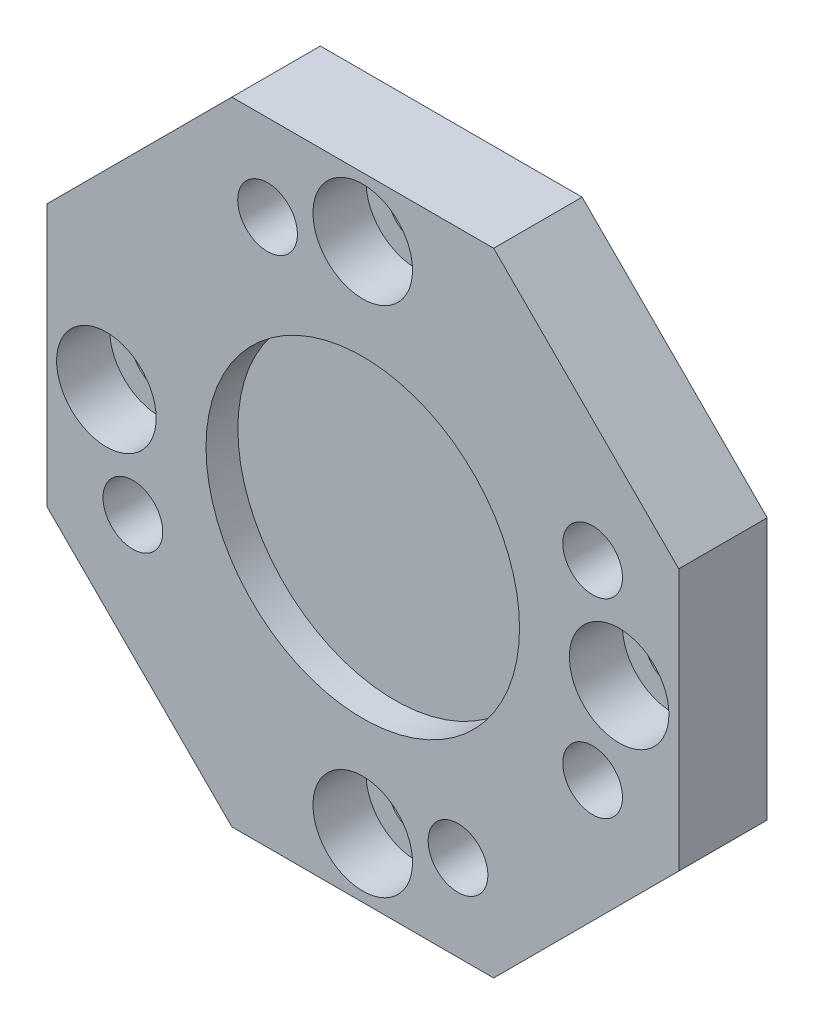
ISO-10303-21;
HEADER;
FILE_DESCRIPTION(('STEP AP214'),'2;1');
FILE_NAME('part.step','',(''),(''),'','','');
FILE_SCHEMA(('AUTOMOTIVE_DESIGN { 1 0 10303 214 1 1 1 1 }'));
ENDSEC;
DATA;
#1=APPLICATION_CONTEXT('core data for automotive mechanical design processes');
#2=APPLICATION_PROTOCOL_DEFINITION('international standard','automotive_design',2000,#1);
#3=PRODUCT_CONTEXT('',#1,'mechanical');
#4=PRODUCT('Part','Part','',(#3));
#5=PRODUCT_RELATED_PRODUCT_CATEGORY('part','',(#4));
#6=PRODUCT_DEFINITION_FORMATION('','',#4);
#7=PRODUCT_DEFINITION_CONTEXT('part definition',#1,'design');
#8=PRODUCT_DEFINITION('design','',#6,#7);
#9=PRODUCT_DEFINITION_SHAPE('','',#8);
#10=(LENGTH_UNIT() NAMED_UNIT(*) SI_UNIT(.MILLI.,.METRE.));
#11=(NAMED_UNIT(*) PLANE_ANGLE_UNIT() SI_UNIT($,.RADIAN.));
#12=(NAMED_UNIT(*) SI_UNIT($,.STERADIAN.) SOLID_ANGLE_UNIT());
#13=UNCERTAINTY_MEASURE_WITH_UNIT(LENGTH_MEASURE(1.E-05),#10,'distance_accuracy_value','');
#14=(GEOMETRIC_REPRESENTATION_CONTEXT(3) GLOBAL_UNCERTAINTY_ASSIGNED_CONTEXT((#13)) GLOBAL_UNIT_ASSIGNED_CONTEXT((#10,
#11,#12)) REPRESENTATION_CONTEXT('',''));
#15=CARTESIAN_POINT('',(0.,0.,0.));
#16=DIRECTION('',(0.,0.,1.));
#17=DIRECTION('',(1.,0.,0.));
#18=AXIS2_PLACEMENT_3D('',#15,#16,#17);
#19=CARTESIAN_POINT('',(0.,0.,0.));
#20=DIRECTION('',(0.,0.,1.));
#21=DIRECTION('',(1.,0.,0.));
#22=AXIS2_PLACEMENT_3D('',#19,#20,#21);
#23=PLANE('',#22);
#24=CARTESIAN_POINT('',(23.0969883127822,-9.56708580912725,0.));
#25=DIRECTION('',(0.,0.,1.));
#26=DIRECTION('',(1.,0.,0.));
#27=AXIS2_PLACEMENT_3D('',#24,#25,#26);
#28=CIRCLE('',#27,3.);
#29=CARTESIAN_POINT('',(26.0969883127822,-9.56708580912725,0.));
#30=VERTEX_POINT('',#29);
#31=EDGE_CURVE('E325',#30,#30,#28,.T.);
#32=ORIENTED_EDGE('',*,*,#31,.T.);
#33=EDGE_LOOP('',(#32));
#34=FACE_BOUND('',#33,.T.);
#35=CARTESIAN_POINT('',(23.0969883127822,9.56708580912723,0.));
#36=DIRECTION('',(0.,0.,-1.));
#37=DIRECTION('',(-1.,0.,0.));
#38=AXIS2_PLACEMENT_3D('',#35,#36,#37);
#39=CIRCLE('',#38,3.);
#40=CARTESIAN_POINT('',(20.0969883127822,9.56708580912723,0.));
#41=VERTEX_POINT('',#40);
#42=EDGE_CURVE('E313',#41,#41,#39,.T.);
#43=ORIENTED_EDGE('',*,*,#42,.F.);
#44=EDGE_LOOP('',(#43));
#45=FACE_BOUND('',#44,.T.);
#46=CARTESIAN_POINT('',(-9.56708580912724,23.0969883127822,0.));
#47=DIRECTION('',(0.,0.,-1.));
#48=DIRECTION('',(-1.,0.,0.));
#49=AXIS2_PLACEMENT_3D('',#46,#47,#48);
#50=CIRCLE('',#49,3.);
#51=CARTESIAN_POINT('',(-12.5670858091272,23.0969883127822,0.));
#52=VERTEX_POINT('',#51);
#53=EDGE_CURVE('E305',#52,#52,#50,.T.);
#54=ORIENTED_EDGE('',*,*,#53,.F.);
#55=EDGE_LOOP('',(#54));
#56=FACE_BOUND('',#55,.T.);
#57=CARTESIAN_POINT('',(-23.0969883127822,-9.56708580912724,0.));
#58=DIRECTION('',(0.,0.,-1.));
#59=DIRECTION('',(-1.,0.,0.));
#60=AXIS2_PLACEMENT_3D('',#57,#58,#59);
#61=CIRCLE('',#60,3.);
#62=CARTESIAN_POINT('',(-26.0969883127822,-9.56708580912724,0.));
#63=VERTEX_POINT('',#62);
#64=EDGE_CURVE('E297',#63,#63,#61,.T.);
#65=ORIENTED_EDGE('',*,*,#64,.F.);
#66=EDGE_LOOP('',(#65));
#67=FACE_BOUND('',#66,.T.);
#68=CARTESIAN_POINT('',(0.,25.76,0.));
#69=DIRECTION('',(0.,0.,1.));
#70=DIRECTION('',(1.,0.,0.));
#71=AXIS2_PLACEMENT_3D('',#68,#69,#70);
#72=CIRCLE('',#71,2.75);
#73=CARTESIAN_POINT('',(2.74999999999999,25.76,0.));
#74=VERTEX_POINT('',#73);
#75=EDGE_CURVE('E277',#74,#74,#72,.T.);
#76=ORIENTED_EDGE('',*,*,#75,.T.);
#77=EDGE_LOOP('',(#76));
#78=FACE_BOUND('',#77,.T.);
#79=CARTESIAN_POINT('',(25.76,0.,0.));
#80=DIRECTION('',(0.,0.,1.));
#81=DIRECTION('',(1.,0.,0.));
#82=AXIS2_PLACEMENT_3D('',#79,#80,#81);
#83=CIRCLE('',#82,2.75);
#84=CARTESIAN_POINT('',(28.51,0.,0.));
#85=VERTEX_POINT('',#84);
#86=EDGE_CURVE('E261',#85,#85,#83,.T.);
#87=ORIENTED_EDGE('',*,*,#86,.T.);
#88=EDGE_LOOP('',(#87));
#89=FACE_BOUND('',#88,.T.);
#90=CARTESIAN_POINT('',(0.,-25.76,0.));
#91=DIRECTION('',(0.,0.,1.));
#92=DIRECTION('',(1.,0.,0.));
#93=AXIS2_PLACEMENT_3D('',#90,#91,#92);
#94=CIRCLE('',#93,2.75);
#95=CARTESIAN_POINT('',(2.75000000000001,-25.76,0.));
#96=VERTEX_POINT('',#95);
#97=EDGE_CURVE('E245',#96,#96,#94,.T.);
#98=ORIENTED_EDGE('',*,*,#97,.T.);
#99=EDGE_LOOP('',(#98));
#100=FACE_BOUND('',#99,.T.);
#101=CARTESIAN_POINT('',(-25.76,0.,0.));
#102=DIRECTION('',(0.,0.,1.));
#103=DIRECTION('',(1.,0.,0.));
#104=AXIS2_PLACEMENT_3D('',#101,#102,#103);
#105=CIRCLE('',#104,2.75);
#106=CARTESIAN_POINT('',(-23.01,0.,0.));
#107=VERTEX_POINT('',#106);
#108=EDGE_CURVE('E229',#107,#107,#105,.T.);
#109=ORIENTED_EDGE('',*,*,#108,.T.);
#110=EDGE_LOOP('',(#109));
#111=FACE_BOUND('',#110,.T.);
#112=CARTESIAN_POINT('',(0.,0.,0.));
#113=DIRECTION('',(0.,0.,1.));
#114=DIRECTION('',(1.,0.,0.));
#115=AXIS2_PLACEMENT_3D('',#112,#113,#114);
#116=CIRCLE('',#115,21.8059);
#117=CARTESIAN_POINT('',(21.8059,0.,0.));
#118=VERTEX_POINT('',#117);
#119=EDGE_CURVE('E210',#118,#118,#116,.T.);
#120=ORIENTED_EDGE('',*,*,#119,.T.);
#121=EDGE_LOOP('',(#120));
#122=FACE_BOUND('',#121,.T.);
#123=DIRECTION('',(-0.707106781186548,0.707106781186547,0.));
#124=VECTOR('',#123,1.);
#125=CARTESIAN_POINT('',(22.4506403026729,22.4506403026729,0.));
#126=LINE('',#125,#124);
#127=CARTESIAN_POINT('',(31.7500000000001,13.1512806053458,0.));
#128=VERTEX_POINT('',#127);
#129=CARTESIAN_POINT('',(13.1512806053458,31.75,0.));
#130=VERTEX_POINT('',#129);
#131=EDGE_CURVE('E143',#128,#130,#126,.T.);
#132=ORIENTED_EDGE('',*,*,#131,.F.);
#133=DIRECTION('',(0.,1.,0.));
#134=VECTOR('',#133,1.);
#135=CARTESIAN_POINT('',(31.7500000000001,0.,0.));
#136=LINE('',#135,#134);
#137=CARTESIAN_POINT('',(31.7500000000001,-13.1512806053458,0.));
#138=VERTEX_POINT('',#137);
#139=EDGE_CURVE('E94',#138,#128,#136,.T.);
#140=ORIENTED_EDGE('',*,*,#139,.F.);
#141=DIRECTION('',(0.707106781186547,0.707106781186548,0.));
#142=VECTOR('',#141,1.);
#143=CARTESIAN_POINT('',(22.4506403026729,-22.4506403026729,0.));
#144=LINE('',#143,#142);
#145=CARTESIAN_POINT('',(13.1512806053458,-31.75,0.));
#146=VERTEX_POINT('',#145);
#147=EDGE_CURVE('E88',#146,#138,#144,.T.);
#148=ORIENTED_EDGE('',*,*,#147,.F.);
#149=DIRECTION('',(1.,0.,0.));
#150=VECTOR('',#149,1.);
#151=CARTESIAN_POINT('',(0.,-31.75,0.));
#152=LINE('',#151,#150);
#153=CARTESIAN_POINT('',(-13.1512806053457,-31.75,0.));
#154=VERTEX_POINT('',#153);
#155=EDGE_CURVE('E130',#154,#146,#152,.T.);
#156=ORIENTED_EDGE('',*,*,#155,.F.);
#157=DIRECTION('',(0.707106781186548,-0.707106781186547,0.));
#158=VECTOR('',#157,1.);
#159=CARTESIAN_POINT('',(-22.4506403026728,-22.4506403026729,0.));
#160=LINE('',#159,#158);
#161=CARTESIAN_POINT('',(-31.7499999999999,-13.1512806053458,0.));
#162=VERTEX_POINT('',#161);
#163=EDGE_CURVE('E157',#162,#154,#160,.T.);
#164=ORIENTED_EDGE('',*,*,#163,.F.);
#165=DIRECTION('',(0.,-1.,0.));
#166=VECTOR('',#165,1.);
#167=CARTESIAN_POINT('',(-31.7499999999999,0.,0.));
#168=LINE('',#167,#166);
#169=CARTESIAN_POINT('',(-31.7499999999999,13.1512806053458,0.));
#170=VERTEX_POINT('',#169);
#171=EDGE_CURVE('E154',#170,#162,#168,.T.);
#172=ORIENTED_EDGE('',*,*,#171,.F.);
#173=DIRECTION('',(-0.707106781186547,-0.707106781186548,0.));
#174=VECTOR('',#173,1.);
#175=CARTESIAN_POINT('',(-22.4506403026729,22.4506403026728,0.));
#176=LINE('',#175,#174);
#177=CARTESIAN_POINT('',(-13.1512806053457,31.75,0.));
#178=VERTEX_POINT('',#177);
#179=EDGE_CURVE('E151',#178,#170,#176,.T.);
#180=ORIENTED_EDGE('',*,*,#179,.F.);
#181=DIRECTION('',(-1.,0.,0.));
#182=VECTOR('',#181,1.);
#183=CARTESIAN_POINT('',(0.,31.75,0.));
#184=LINE('',#183,#182);
#185=EDGE_CURVE('E147',#130,#178,#184,.T.);
#186=ORIENTED_EDGE('',*,*,#185,.F.);
#187=EDGE_LOOP('',(#132,#140,#148,#156,#164,#172,#180,#186));
#188=FACE_BOUND('',#187,.T.);
#189=CARTESIAN_POINT('',(9.56708580912724,-23.0969883127822,0.));
#190=DIRECTION('',(0.,0.,-1.));
#191=DIRECTION('',(-1.,0.,0.));
#192=AXIS2_PLACEMENT_3D('',#189,#190,#191);
#193=CIRCLE('',#192,3.);
#194=CARTESIAN_POINT('',(6.56708580912723,-23.0969883127822,0.));
#195=VERTEX_POINT('',#194);
#196=EDGE_CURVE('E286',#195,#195,#193,.T.);
#197=ORIENTED_EDGE('',*,*,#196,.F.);
#198=EDGE_LOOP('',(#197));
#199=FACE_BOUND('',#198,.T.);
#200=ADVANCED_FACE('F41',(#34,#45,#56,#67,#78,#89,#100,#111,#122,#188,#199),#23,.F.);
#201=CARTESIAN_POINT('',(22.4506403026729,22.4506403026729,8.89));
#202=DIRECTION('',(-0.707106781186547,-0.707106781186548,0.));
#203=DIRECTION('',(0.707106781186548,-0.707106781186547,0.));
#204=AXIS2_PLACEMENT_3D('',#201,#202,#203);
#205=PLANE('',#204);
#206=ORIENTED_EDGE('',*,*,#131,.T.);
#207=DIRECTION('',(0.,0.,-1.));
#208=VECTOR('',#207,1.);
#209=CARTESIAN_POINT('',(13.1512806053458,31.75,8.89));
#210=LINE('',#209,#208);
#211=CARTESIAN_POINT('',(13.1512806053458,31.75,8.89));
#212=VERTEX_POINT('',#211);
#213=EDGE_CURVE('E11',#212,#130,#210,.T.);
#214=ORIENTED_EDGE('',*,*,#213,.F.);
#215=DIRECTION('',(-0.707106781186548,0.707106781186547,0.));
#216=VECTOR('',#215,1.);
#217=CARTESIAN_POINT('',(22.4506403026729,22.4506403026729,8.89));
#218=LINE('',#217,#216);
#219=CARTESIAN_POINT('',(31.7500000000001,13.1512806053458,8.89));
#220=VERTEX_POINT('',#219);
#221=EDGE_CURVE('E166',#220,#212,#218,.T.);
#222=ORIENTED_EDGE('',*,*,#221,.F.);
#223=DIRECTION('',(0.,0.,-1.));
#224=VECTOR('',#223,1.);
#225=CARTESIAN_POINT('',(31.7500000000001,13.1512806053458,8.89));
#226=LINE('',#225,#224);
#227=EDGE_CURVE('E139',#220,#128,#226,.T.);
#228=ORIENTED_EDGE('',*,*,#227,.T.);
#229=EDGE_LOOP('',(#206,#214,#222,#228));
#230=FACE_BOUND('',#229,.T.);
#231=ADVANCED_FACE('F43',(#230),#205,.F.);
#232=CARTESIAN_POINT('',(0.,31.75,8.89));
#233=DIRECTION('',(0.,-1.,0.));
#234=DIRECTION('',(0.,0.,-1.));
#235=AXIS2_PLACEMENT_3D('',#232,#233,#234);
#236=PLANE('',#235);
#237=ORIENTED_EDGE('',*,*,#185,.T.);
#238=DIRECTION('',(0.,0.,-1.));
#239=VECTOR('',#238,1.);
#240=CARTESIAN_POINT('',(-13.1512806053457,31.75,8.89));
#241=LINE('',#240,#239);
#242=CARTESIAN_POINT('',(-13.1512806053457,31.75,8.89));
#243=VERTEX_POINT('',#242);
#244=EDGE_CURVE('E51',#243,#178,#241,.T.);
#245=ORIENTED_EDGE('',*,*,#244,.F.);
#246=DIRECTION('',(-1.,0.,0.));
#247=VECTOR('',#246,1.);
#248=CARTESIAN_POINT('',(0.,31.75,8.89));
#249=LINE('',#248,#247);
#250=EDGE_CURVE('E102',#212,#243,#249,.T.);
#251=ORIENTED_EDGE('',*,*,#250,.F.);
#252=ORIENTED_EDGE('',*,*,#213,.T.);
#253=EDGE_LOOP('',(#237,#245,#251,#252));
#254=FACE_BOUND('',#253,.T.);
#255=ADVANCED_FACE('F383',(#254),#236,.F.);
#256=CARTESIAN_POINT('',(-22.4506403026729,22.4506403026728,8.89));
#257=DIRECTION('',(0.707106781186548,-0.707106781186547,0.));
#258=DIRECTION('',(0.707106781186547,0.707106781186548,0.));
#259=AXIS2_PLACEMENT_3D('',#256,#257,#258);
#260=PLANE('',#259);
#261=ORIENTED_EDGE('',*,*,#179,.T.);
#262=DIRECTION('',(0.,0.,-1.));
#263=VECTOR('',#262,1.);
#264=CARTESIAN_POINT('',(-31.7499999999999,13.1512806053458,8.89));
#265=LINE('',#264,#263);
#266=CARTESIAN_POINT('',(-31.7499999999999,13.1512806053458,8.89));
#267=VERTEX_POINT('',#266);
#268=EDGE_CURVE('E177',#267,#170,#265,.T.);
#269=ORIENTED_EDGE('',*,*,#268,.F.);
#270=DIRECTION('',(-0.707106781186547,-0.707106781186548,0.));
#271=VECTOR('',#270,1.);
#272=CARTESIAN_POINT('',(-22.4506403026729,22.4506403026728,8.89));
#273=LINE('',#272,#271);
#274=EDGE_CURVE('E187',#243,#267,#273,.T.);
#275=ORIENTED_EDGE('',*,*,#274,.F.);
#276=ORIENTED_EDGE('',*,*,#244,.T.);
#277=EDGE_LOOP('',(#261,#269,#275,#276));
#278=FACE_BOUND('',#277,.T.);
#279=ADVANCED_FACE('F185',(#278),#260,.F.);
#280=CARTESIAN_POINT('',(-31.7499999999999,0.,8.89));
#281=DIRECTION('',(1.,0.,0.));
#282=DIRECTION('',(0.,0.,-1.));
#283=AXIS2_PLACEMENT_3D('',#280,#281,#282);
#284=PLANE('',#283);
#285=ORIENTED_EDGE('',*,*,#171,.T.);
#286=DIRECTION('',(0.,0.,-1.));
#287=VECTOR('',#286,1.);
#288=CARTESIAN_POINT('',(-31.7499999999999,-13.1512806053458,8.89));
#289=LINE('',#288,#287);
#290=CARTESIAN_POINT('',(-31.7499999999999,-13.1512806053458,8.89));
#291=VERTEX_POINT('',#290);
#292=EDGE_CURVE('E173',#291,#162,#289,.T.);
#293=ORIENTED_EDGE('',*,*,#292,.F.);
#294=DIRECTION('',(0.,-1.,0.));
#295=VECTOR('',#294,1.);
#296=CARTESIAN_POINT('',(-31.7499999999999,0.,8.89));
#297=LINE('',#296,#295);
#298=EDGE_CURVE('E200',#267,#291,#297,.T.);
#299=ORIENTED_EDGE('',*,*,#298,.F.);
#300=ORIENTED_EDGE('',*,*,#268,.T.);
#301=EDGE_LOOP('',(#285,#293,#299,#300));
#302=FACE_BOUND('',#301,.T.);
#303=ADVANCED_FACE('F195',(#302),#284,.F.);
#304=CARTESIAN_POINT('',(-22.4506403026728,-22.4506403026729,8.89));
#305=DIRECTION('',(0.707106781186547,0.707106781186548,0.));
#306=DIRECTION('',(-0.707106781186548,0.707106781186547,0.));
#307=AXIS2_PLACEMENT_3D('',#304,#305,#306);
#308=PLANE('',#307);
#309=ORIENTED_EDGE('',*,*,#163,.T.);
#310=DIRECTION('',(0.,0.,-1.));
#311=VECTOR('',#310,1.);
#312=CARTESIAN_POINT('',(-13.1512806053457,-31.75,8.89));
#313=LINE('',#312,#311);
#314=CARTESIAN_POINT('',(-13.1512806053457,-31.75,8.89));
#315=VERTEX_POINT('',#314);
#316=EDGE_CURVE('E132',#315,#154,#313,.T.);
#317=ORIENTED_EDGE('',*,*,#316,.F.);
#318=DIRECTION('',(0.707106781186548,-0.707106781186547,0.));
#319=VECTOR('',#318,1.);
#320=CARTESIAN_POINT('',(-22.4506403026728,-22.4506403026729,8.89));
#321=LINE('',#320,#319);
#322=EDGE_CURVE('E121',#291,#315,#321,.T.);
#323=ORIENTED_EDGE('',*,*,#322,.F.);
#324=ORIENTED_EDGE('',*,*,#292,.T.);
#325=EDGE_LOOP('',(#309,#317,#323,#324));
#326=FACE_BOUND('',#325,.T.);
#327=ADVANCED_FACE('F198',(#326),#308,.F.);
#328=CARTESIAN_POINT('',(0.,-31.75,8.89));
#329=DIRECTION('',(0.,1.,0.));
#330=DIRECTION('',(0.,0.,1.));
#331=AXIS2_PLACEMENT_3D('',#328,#329,#330);
#332=PLANE('',#331);
#333=ORIENTED_EDGE('',*,*,#155,.T.);
#334=DIRECTION('',(0.,0.,-1.));
#335=VECTOR('',#334,1.);
#336=CARTESIAN_POINT('',(13.1512806053458,-31.75,8.89));
#337=LINE('',#336,#335);
#338=CARTESIAN_POINT('',(13.1512806053458,-31.75,8.89));
#339=VERTEX_POINT('',#338);
#340=EDGE_CURVE('E127',#339,#146,#337,.T.);
#341=ORIENTED_EDGE('',*,*,#340,.F.);
#342=DIRECTION('',(1.,0.,0.));
#343=VECTOR('',#342,1.);
#344=CARTESIAN_POINT('',(0.,-31.75,8.89));
#345=LINE('',#344,#343);
#346=EDGE_CURVE('E115',#315,#339,#345,.T.);
#347=ORIENTED_EDGE('',*,*,#346,.F.);
#348=ORIENTED_EDGE('',*,*,#316,.T.);
#349=EDGE_LOOP('',(#333,#341,#347,#348));
#350=FACE_BOUND('',#349,.T.);
#351=ADVANCED_FACE('F128',(#350),#332,.F.);
#352=CARTESIAN_POINT('',(22.4506403026729,-22.4506403026729,8.89));
#353=DIRECTION('',(-0.707106781186548,0.707106781186547,0.));
#354=DIRECTION('',(-0.707106781186547,-0.707106781186548,0.));
#355=AXIS2_PLACEMENT_3D('',#352,#353,#354);
#356=PLANE('',#355);
#357=ORIENTED_EDGE('',*,*,#147,.T.);
#358=DIRECTION('',(0.,0.,-1.));
#359=VECTOR('',#358,1.);
#360=CARTESIAN_POINT('',(31.7500000000001,-13.1512806053458,8.89));
#361=LINE('',#360,#359);
#362=CARTESIAN_POINT('',(31.7500000000001,-13.1512806053458,8.89));
#363=VERTEX_POINT('',#362);
#364=EDGE_CURVE('E133',#363,#138,#361,.T.);
#365=ORIENTED_EDGE('',*,*,#364,.F.);
#366=DIRECTION('',(0.707106781186547,0.707106781186548,0.));
#367=VECTOR('',#366,1.);
#368=CARTESIAN_POINT('',(22.4506403026729,-22.4506403026729,8.89));
#369=LINE('',#368,#367);
#370=EDGE_CURVE('E119',#339,#363,#369,.T.);
#371=ORIENTED_EDGE('',*,*,#370,.F.);
#372=ORIENTED_EDGE('',*,*,#340,.T.);
#373=EDGE_LOOP('',(#357,#365,#371,#372));
#374=FACE_BOUND('',#373,.T.);
#375=ADVANCED_FACE('F135',(#374),#356,.F.);
#376=CARTESIAN_POINT('',(31.7500000000001,0.,8.89));
#377=DIRECTION('',(-1.,0.,0.));
#378=DIRECTION('',(0.,0.,1.));
#379=AXIS2_PLACEMENT_3D('',#376,#377,#378);
#380=PLANE('',#379);
#381=ORIENTED_EDGE('',*,*,#139,.T.);
#382=ORIENTED_EDGE('',*,*,#227,.F.);
#383=DIRECTION('',(0.,1.,0.));
#384=VECTOR('',#383,1.);
#385=CARTESIAN_POINT('',(31.7500000000001,0.,8.89));
#386=LINE('',#385,#384);
#387=EDGE_CURVE('E59',#363,#220,#386,.T.);
#388=ORIENTED_EDGE('',*,*,#387,.F.);
#389=ORIENTED_EDGE('',*,*,#364,.T.);
#390=EDGE_LOOP('',(#381,#382,#388,#389));
#391=FACE_BOUND('',#390,.T.);
#392=ADVANCED_FACE('F342',(#391),#380,.F.);
#393=CARTESIAN_POINT('',(0.,0.,8.89));
#394=DIRECTION('',(0.,0.,1.));
#395=DIRECTION('',(1.,0.,0.));
#396=AXIS2_PLACEMENT_3D('',#393,#394,#395);
#397=PLANE('',#396);
#398=CARTESIAN_POINT('',(23.0969883127822,-9.56708580912725,8.89));
#399=DIRECTION('',(0.,0.,1.));
#400=DIRECTION('',(1.,0.,0.));
#401=AXIS2_PLACEMENT_3D('',#398,#399,#400);
#402=CIRCLE('',#401,3.);
#403=CARTESIAN_POINT('',(26.0969883127822,-9.56708580912725,8.89));
#404=VERTEX_POINT('',#403);
#405=EDGE_CURVE('E321',#404,#404,#402,.T.);
#406=ORIENTED_EDGE('',*,*,#405,.F.);
#407=EDGE_LOOP('',(#406));
#408=FACE_BOUND('',#407,.T.);
#409=CARTESIAN_POINT('',(23.0969883127822,9.56708580912723,8.89));
#410=DIRECTION('',(0.,0.,-1.));
#411=DIRECTION('',(-1.,0.,0.));
#412=AXIS2_PLACEMENT_3D('',#409,#410,#411);
#413=CIRCLE('',#412,3.);
#414=CARTESIAN_POINT('',(20.0969883127822,9.56708580912723,8.89));
#415=VERTEX_POINT('',#414);
#416=EDGE_CURVE('E317',#415,#415,#413,.T.);
#417=ORIENTED_EDGE('',*,*,#416,.T.);
#418=EDGE_LOOP('',(#417));
#419=FACE_BOUND('',#418,.T.);
#420=CARTESIAN_POINT('',(-9.56708580912724,23.0969883127822,8.89));
#421=DIRECTION('',(0.,0.,-1.));
#422=DIRECTION('',(-1.,0.,0.));
#423=AXIS2_PLACEMENT_3D('',#420,#421,#422);
#424=CIRCLE('',#423,3.);
#425=CARTESIAN_POINT('',(-12.5670858091272,23.0969883127822,8.89));
#426=VERTEX_POINT('',#425);
#427=EDGE_CURVE('E309',#426,#426,#424,.T.);
#428=ORIENTED_EDGE('',*,*,#427,.T.);
#429=EDGE_LOOP('',(#428));
#430=FACE_BOUND('',#429,.T.);
#431=CARTESIAN_POINT('',(-23.0969883127822,-9.56708580912724,8.89));
#432=DIRECTION('',(0.,0.,-1.));
#433=DIRECTION('',(-1.,0.,0.));
#434=AXIS2_PLACEMENT_3D('',#431,#432,#433);
#435=CIRCLE('',#434,3.);
#436=CARTESIAN_POINT('',(-26.0969883127822,-9.56708580912724,8.89));
#437=VERTEX_POINT('',#436);
#438=EDGE_CURVE('E301',#437,#437,#435,.T.);
#439=ORIENTED_EDGE('',*,*,#438,.T.);
#440=EDGE_LOOP('',(#439));
#441=FACE_BOUND('',#440,.T.);
#442=CARTESIAN_POINT('',(9.56708580912724,-23.0969883127822,8.89));
#443=DIRECTION('',(0.,0.,-1.));
#444=DIRECTION('',(-1.,0.,0.));
#445=AXIS2_PLACEMENT_3D('',#442,#443,#444);
#446=CIRCLE('',#445,3.);
#447=CARTESIAN_POINT('',(6.56708580912723,-23.0969883127822,8.89));
#448=VERTEX_POINT('',#447);
#449=EDGE_CURVE('E293',#448,#448,#446,.T.);
#450=ORIENTED_EDGE('',*,*,#449,.T.);
#451=EDGE_LOOP('',(#450));
#452=FACE_BOUND('',#451,.T.);
#453=CARTESIAN_POINT('',(0.,0.,8.89));
#454=DIRECTION('',(0.,0.,1.));
#455=DIRECTION('',(1.,0.,0.));
#456=AXIS2_PLACEMENT_3D('',#453,#454,#455);
#457=CIRCLE('',#456,15.75);
#458=CARTESIAN_POINT('',(15.75,0.,8.89));
#459=VERTEX_POINT('',#458);
#460=EDGE_CURVE('E282',#459,#459,#457,.T.);
#461=ORIENTED_EDGE('',*,*,#460,.F.);
#462=EDGE_LOOP('',(#461));
#463=FACE_BOUND('',#462,.T.);
#464=CARTESIAN_POINT('',(0.,25.76,8.89));
#465=DIRECTION('',(0.,0.,1.));
#466=DIRECTION('',(1.,0.,0.));
#467=AXIS2_PLACEMENT_3D('',#464,#465,#466);
#468=CIRCLE('',#467,5.);
#469=CARTESIAN_POINT('',(4.99999999999999,25.76,8.89));
#470=VERTEX_POINT('',#469);
#471=EDGE_CURVE('E265',#470,#470,#468,.T.);
#472=ORIENTED_EDGE('',*,*,#471,.F.);
#473=EDGE_LOOP('',(#472));
#474=FACE_BOUND('',#473,.T.);
#475=CARTESIAN_POINT('',(25.76,0.,8.89));
#476=DIRECTION('',(0.,0.,1.));
#477=DIRECTION('',(1.,0.,0.));
#478=AXIS2_PLACEMENT_3D('',#475,#476,#477);
#479=CIRCLE('',#478,5.);
#480=CARTESIAN_POINT('',(30.76,0.,8.89));
#481=VERTEX_POINT('',#480);
#482=EDGE_CURVE('E249',#481,#481,#479,.T.);
#483=ORIENTED_EDGE('',*,*,#482,.F.);
#484=EDGE_LOOP('',(#483));
#485=FACE_BOUND('',#484,.T.);
#486=CARTESIAN_POINT('',(0.,-25.76,8.89));
#487=DIRECTION('',(0.,0.,1.));
#488=DIRECTION('',(1.,0.,0.));
#489=AXIS2_PLACEMENT_3D('',#486,#487,#488);
#490=CIRCLE('',#489,5.);
#491=CARTESIAN_POINT('',(5.00000000000001,-25.76,8.89));
#492=VERTEX_POINT('',#491);
#493=EDGE_CURVE('E233',#492,#492,#490,.T.);
#494=ORIENTED_EDGE('',*,*,#493,.F.);
#495=EDGE_LOOP('',(#494));
#496=FACE_BOUND('',#495,.T.);
#497=CARTESIAN_POINT('',(-25.76,0.,8.89));
#498=DIRECTION('',(0.,0.,1.));
#499=DIRECTION('',(1.,0.,0.));
#500=AXIS2_PLACEMENT_3D('',#497,#498,#499);
#501=CIRCLE('',#500,5.);
#502=CARTESIAN_POINT('',(-20.76,0.,8.89));
#503=VERTEX_POINT('',#502);
#504=EDGE_CURVE('E214',#503,#503,#501,.T.);
#505=ORIENTED_EDGE('',*,*,#504,.F.);
#506=EDGE_LOOP('',(#505));
#507=FACE_BOUND('',#506,.T.);
#508=ORIENTED_EDGE('',*,*,#221,.T.);
#509=ORIENTED_EDGE('',*,*,#250,.T.);
#510=ORIENTED_EDGE('',*,*,#274,.T.);
#511=ORIENTED_EDGE('',*,*,#298,.T.);
#512=ORIENTED_EDGE('',*,*,#322,.T.);
#513=ORIENTED_EDGE('',*,*,#346,.T.);
#514=ORIENTED_EDGE('',*,*,#370,.T.);
#515=ORIENTED_EDGE('',*,*,#387,.T.);
#516=EDGE_LOOP('',(#508,#509,#510,#511,#512,#513,#514,#515));
#517=FACE_BOUND('',#516,.T.);
#518=ADVANCED_FACE('F117',(#408,#419,#430,#441,#452,#463,#474,#485,#496,#507,#517),#397,.T.);
#519=CARTESIAN_POINT('',(0.,0.,3.2));
#520=DIRECTION('',(0.,0.,-1.));
#521=DIRECTION('',(-1.,0.,0.));
#522=AXIS2_PLACEMENT_3D('',#519,#520,#521);
#523=CYLINDRICAL_SURFACE('',#522,21.8059);
#524=CARTESIAN_POINT('',(0.,0.,3.2));
#525=DIRECTION('',(0.,0.,1.));
#526=DIRECTION('',(1.,0.,0.));
#527=AXIS2_PLACEMENT_3D('',#524,#525,#526);
#528=CIRCLE('',#527,21.8059);
#529=CARTESIAN_POINT('',(21.8059,0.,3.2));
#530=VERTEX_POINT('',#529);
#531=EDGE_CURVE('E148',#530,#530,#528,.T.);
#532=ORIENTED_EDGE('',*,*,#531,.T.);
#533=EDGE_LOOP('',(#532));
#534=FACE_BOUND('',#533,.T.);
#535=ORIENTED_EDGE('',*,*,#119,.F.);
#536=EDGE_LOOP('',(#535));
#537=FACE_BOUND('',#536,.T.);
#538=ADVANCED_FACE('F341',(#534,#537),#523,.F.);
#539=CARTESIAN_POINT('',(0.,0.,3.2));
#540=DIRECTION('',(0.,0.,1.));
#541=DIRECTION('',(1.,0.,0.));
#542=AXIS2_PLACEMENT_3D('',#539,#540,#541);
#543=PLANE('',#542);
#544=ORIENTED_EDGE('',*,*,#531,.F.);
#545=EDGE_LOOP('',(#544));
#546=FACE_BOUND('',#545,.T.);
#547=ADVANCED_FACE('F365',(#546),#543,.F.);
#548=CARTESIAN_POINT('',(-25.76,0.,8.89));
#549=DIRECTION('',(0.,0.,1.));
#550=DIRECTION('',(1.,0.,0.));
#551=AXIS2_PLACEMENT_3D('',#548,#549,#550);
#552=CYLINDRICAL_SURFACE('',#551,5.);
#553=CARTESIAN_POINT('',(-25.76,0.,3.556));
#554=DIRECTION('',(0.,0.,1.));
#555=DIRECTION('',(1.,0.,0.));
#556=AXIS2_PLACEMENT_3D('',#553,#554,#555);
#557=CIRCLE('',#556,5.);
#558=CARTESIAN_POINT('',(-20.76,0.,3.556));
#559=VERTEX_POINT('',#558);
#560=EDGE_CURVE('E221',#559,#559,#557,.T.);
#561=ORIENTED_EDGE('',*,*,#560,.F.);
#562=EDGE_LOOP('',(#561));
#563=FACE_BOUND('',#562,.T.);
#564=ORIENTED_EDGE('',*,*,#504,.T.);
#565=EDGE_LOOP('',(#564));
#566=FACE_BOUND('',#565,.T.);
#567=ADVANCED_FACE('F362',(#563,#566),#552,.F.);
#568=CARTESIAN_POINT('',(-20.76,0.,3.556));
#569=DIRECTION('',(0.,0.,-1.));
#570=DIRECTION('',(-1.,0.,0.));
#571=AXIS2_PLACEMENT_3D('',#568,#569,#570);
#572=PLANE('',#571);
#573=CARTESIAN_POINT('',(-25.76,0.,3.556));
#574=DIRECTION('',(0.,0.,1.));
#575=DIRECTION('',(1.,0.,0.));
#576=AXIS2_PLACEMENT_3D('',#573,#574,#575);
#577=CIRCLE('',#576,2.75);
#578=CARTESIAN_POINT('',(-23.01,0.,3.556));
#579=VERTEX_POINT('',#578);
#580=EDGE_CURVE('E225',#579,#579,#577,.T.);
#581=ORIENTED_EDGE('',*,*,#580,.F.);
#582=EDGE_LOOP('',(#581));
#583=FACE_BOUND('',#582,.T.);
#584=ORIENTED_EDGE('',*,*,#560,.T.);
#585=EDGE_LOOP('',(#584));
#586=FACE_BOUND('',#585,.T.);
#587=ADVANCED_FACE('F364',(#583,#586),#572,.F.);
#588=CARTESIAN_POINT('',(-25.76,0.,8.89));
#589=DIRECTION('',(0.,0.,1.));
#590=DIRECTION('',(1.,0.,0.));
#591=AXIS2_PLACEMENT_3D('',#588,#589,#590);
#592=CYLINDRICAL_SURFACE('',#591,2.75);
#593=ORIENTED_EDGE('',*,*,#108,.F.);
#594=EDGE_LOOP('',(#593));
#595=FACE_BOUND('',#594,.T.);
#596=ORIENTED_EDGE('',*,*,#580,.T.);
#597=EDGE_LOOP('',(#596));
#598=FACE_BOUND('',#597,.T.);
#599=ADVANCED_FACE('F372',(#595,#598),#592,.F.);
#600=CARTESIAN_POINT('',(0.,-25.76,8.89));
#601=DIRECTION('',(0.,0.,1.));
#602=DIRECTION('',(1.,0.,0.));
#603=AXIS2_PLACEMENT_3D('',#600,#601,#602);
#604=CYLINDRICAL_SURFACE('',#603,5.);
#605=CARTESIAN_POINT('',(0.,-25.76,3.556));
#606=DIRECTION('',(0.,0.,1.));
#607=DIRECTION('',(1.,0.,0.));
#608=AXIS2_PLACEMENT_3D('',#605,#606,#607);
#609=CIRCLE('',#608,5.);
#610=CARTESIAN_POINT('',(5.00000000000001,-25.76,3.556));
#611=VERTEX_POINT('',#610);
#612=EDGE_CURVE('E237',#611,#611,#609,.T.);
#613=ORIENTED_EDGE('',*,*,#612,.F.);
#614=EDGE_LOOP('',(#613));
#615=FACE_BOUND('',#614,.T.);
#616=ORIENTED_EDGE('',*,*,#493,.T.);
#617=EDGE_LOOP('',(#616));
#618=FACE_BOUND('',#617,.T.);
#619=ADVANCED_FACE('F463',(#615,#618),#604,.F.);
#620=CARTESIAN_POINT('',(5.00000000000001,-25.76,3.556));
#621=DIRECTION('',(0.,0.,-1.));
#622=DIRECTION('',(-1.,0.,0.));
#623=AXIS2_PLACEMENT_3D('',#620,#621,#622);
#624=PLANE('',#623);
#625=CARTESIAN_POINT('',(0.,-25.76,3.556));
#626=DIRECTION('',(0.,0.,1.));
#627=DIRECTION('',(1.,0.,0.));
#628=AXIS2_PLACEMENT_3D('',#625,#626,#627);
#629=CIRCLE('',#628,2.75);
#630=CARTESIAN_POINT('',(2.75000000000001,-25.76,3.556));
#631=VERTEX_POINT('',#630);
#632=EDGE_CURVE('E241',#631,#631,#629,.T.);
#633=ORIENTED_EDGE('',*,*,#632,.F.);
#634=EDGE_LOOP('',(#633));
#635=FACE_BOUND('',#634,.T.);
#636=ORIENTED_EDGE('',*,*,#612,.T.);
#637=EDGE_LOOP('',(#636));
#638=FACE_BOUND('',#637,.T.);
#639=ADVANCED_FACE('F473',(#635,#638),#624,.F.);
#640=CARTESIAN_POINT('',(0.,-25.76,8.89));
#641=DIRECTION('',(0.,0.,1.));
#642=DIRECTION('',(1.,0.,0.));
#643=AXIS2_PLACEMENT_3D('',#640,#641,#642);
#644=CYLINDRICAL_SURFACE('',#643,2.75);
#645=ORIENTED_EDGE('',*,*,#97,.F.);
#646=EDGE_LOOP('',(#645));
#647=FACE_BOUND('',#646,.T.);
#648=ORIENTED_EDGE('',*,*,#632,.T.);
#649=EDGE_LOOP('',(#648));
#650=FACE_BOUND('',#649,.T.);
#651=ADVANCED_FACE('F483',(#647,#650),#644,.F.);
#652=CARTESIAN_POINT('',(25.76,0.,8.89));
#653=DIRECTION('',(0.,0.,1.));
#654=DIRECTION('',(1.,0.,0.));
#655=AXIS2_PLACEMENT_3D('',#652,#653,#654);
#656=CYLINDRICAL_SURFACE('',#655,5.);
#657=CARTESIAN_POINT('',(25.76,0.,3.556));
#658=DIRECTION('',(0.,0.,1.));
#659=DIRECTION('',(1.,0.,0.));
#660=AXIS2_PLACEMENT_3D('',#657,#658,#659);
#661=CIRCLE('',#660,5.);
#662=CARTESIAN_POINT('',(30.76,0.,3.556));
#663=VERTEX_POINT('',#662);
#664=EDGE_CURVE('E253',#663,#663,#661,.T.);
#665=ORIENTED_EDGE('',*,*,#664,.F.);
#666=EDGE_LOOP('',(#665));
#667=FACE_BOUND('',#666,.T.);
#668=ORIENTED_EDGE('',*,*,#482,.T.);
#669=EDGE_LOOP('',(#668));
#670=FACE_BOUND('',#669,.T.);
#671=ADVANCED_FACE('F493',(#667,#670),#656,.F.);
#672=CARTESIAN_POINT('',(30.76,0.,3.556));
#673=DIRECTION('',(0.,0.,-1.));
#674=DIRECTION('',(-1.,0.,0.));
#675=AXIS2_PLACEMENT_3D('',#672,#673,#674);
#676=PLANE('',#675);
#677=CARTESIAN_POINT('',(25.76,0.,3.556));
#678=DIRECTION('',(0.,0.,1.));
#679=DIRECTION('',(1.,0.,0.));
#680=AXIS2_PLACEMENT_3D('',#677,#678,#679);
#681=CIRCLE('',#680,2.75);
#682=CARTESIAN_POINT('',(28.51,0.,3.556));
#683=VERTEX_POINT('',#682);
#684=EDGE_CURVE('E257',#683,#683,#681,.T.);
#685=ORIENTED_EDGE('',*,*,#684,.F.);
#686=EDGE_LOOP('',(#685));
#687=FACE_BOUND('',#686,.T.);
#688=ORIENTED_EDGE('',*,*,#664,.T.);
#689=EDGE_LOOP('',(#688));
#690=FACE_BOUND('',#689,.T.);
#691=ADVANCED_FACE('F503',(#687,#690),#676,.F.);
#692=CARTESIAN_POINT('',(25.76,0.,8.89));
#693=DIRECTION('',(0.,0.,1.));
#694=DIRECTION('',(1.,0.,0.));
#695=AXIS2_PLACEMENT_3D('',#692,#693,#694);
#696=CYLINDRICAL_SURFACE('',#695,2.75);
#697=ORIENTED_EDGE('',*,*,#86,.F.);
#698=EDGE_LOOP('',(#697));
#699=FACE_BOUND('',#698,.T.);
#700=ORIENTED_EDGE('',*,*,#684,.T.);
#701=EDGE_LOOP('',(#700));
#702=FACE_BOUND('',#701,.T.);
#703=ADVANCED_FACE('F513',(#699,#702),#696,.F.);
#704=CARTESIAN_POINT('',(0.,25.76,8.89));
#705=DIRECTION('',(0.,0.,1.));
#706=DIRECTION('',(1.,0.,0.));
#707=AXIS2_PLACEMENT_3D('',#704,#705,#706);
#708=CYLINDRICAL_SURFACE('',#707,5.);
#709=CARTESIAN_POINT('',(0.,25.76,3.556));
#710=DIRECTION('',(0.,0.,1.));
#711=DIRECTION('',(1.,0.,0.));
#712=AXIS2_PLACEMENT_3D('',#709,#710,#711);
#713=CIRCLE('',#712,5.);
#714=CARTESIAN_POINT('',(4.99999999999999,25.76,3.556));
#715=VERTEX_POINT('',#714);
#716=EDGE_CURVE('E269',#715,#715,#713,.T.);
#717=ORIENTED_EDGE('',*,*,#716,.F.);
#718=EDGE_LOOP('',(#717));
#719=FACE_BOUND('',#718,.T.);
#720=ORIENTED_EDGE('',*,*,#471,.T.);
#721=EDGE_LOOP('',(#720));
#722=FACE_BOUND('',#721,.T.);
#723=ADVANCED_FACE('F523',(#719,#722),#708,.F.);
#724=CARTESIAN_POINT('',(4.99999999999999,25.76,3.556));
#725=DIRECTION('',(0.,0.,-1.));
#726=DIRECTION('',(-1.,0.,0.));
#727=AXIS2_PLACEMENT_3D('',#724,#725,#726);
#728=PLANE('',#727);
#729=CARTESIAN_POINT('',(0.,25.76,3.556));
#730=DIRECTION('',(0.,0.,1.));
#731=DIRECTION('',(1.,0.,0.));
#732=AXIS2_PLACEMENT_3D('',#729,#730,#731);
#733=CIRCLE('',#732,2.75);
#734=CARTESIAN_POINT('',(2.74999999999999,25.76,3.556));
#735=VERTEX_POINT('',#734);
#736=EDGE_CURVE('E273',#735,#735,#733,.T.);
#737=ORIENTED_EDGE('',*,*,#736,.F.);
#738=EDGE_LOOP('',(#737));
#739=FACE_BOUND('',#738,.T.);
#740=ORIENTED_EDGE('',*,*,#716,.T.);
#741=EDGE_LOOP('',(#740));
#742=FACE_BOUND('',#741,.T.);
#743=ADVANCED_FACE('F533',(#739,#742),#728,.F.);
#744=CARTESIAN_POINT('',(0.,25.76,8.89));
#745=DIRECTION('',(0.,0.,1.));
#746=DIRECTION('',(1.,0.,0.));
#747=AXIS2_PLACEMENT_3D('',#744,#745,#746);
#748=CYLINDRICAL_SURFACE('',#747,2.75);
#749=ORIENTED_EDGE('',*,*,#75,.F.);
#750=EDGE_LOOP('',(#749));
#751=FACE_BOUND('',#750,.T.);
#752=ORIENTED_EDGE('',*,*,#736,.T.);
#753=EDGE_LOOP('',(#752));
#754=FACE_BOUND('',#753,.T.);
#755=ADVANCED_FACE('F543',(#751,#754),#748,.F.);
#756=CARTESIAN_POINT('',(0.,0.,5.69));
#757=DIRECTION('',(0.,0.,1.));
#758=DIRECTION('',(1.,0.,0.));
#759=AXIS2_PLACEMENT_3D('',#756,#757,#758);
#760=CYLINDRICAL_SURFACE('',#759,15.75);
#761=CARTESIAN_POINT('',(0.,0.,5.69));
#762=DIRECTION('',(0.,0.,1.));
#763=DIRECTION('',(1.,0.,0.));
#764=AXIS2_PLACEMENT_3D('',#761,#762,#763);
#765=CIRCLE('',#764,15.75);
#766=CARTESIAN_POINT('',(15.75,0.,5.69));
#767=VERTEX_POINT('',#766);
#768=EDGE_CURVE('E281',#767,#767,#765,.T.);
#769=ORIENTED_EDGE('',*,*,#768,.F.);
#770=EDGE_LOOP('',(#769));
#771=FACE_BOUND('',#770,.T.);
#772=ORIENTED_EDGE('',*,*,#460,.T.);
#773=EDGE_LOOP('',(#772));
#774=FACE_BOUND('',#773,.T.);
#775=ADVANCED_FACE('F553',(#771,#774),#760,.F.);
#776=CARTESIAN_POINT('',(0.,0.,5.69));
#777=DIRECTION('',(0.,0.,1.));
#778=DIRECTION('',(1.,0.,0.));
#779=AXIS2_PLACEMENT_3D('',#776,#777,#778);
#780=PLANE('',#779);
#781=ORIENTED_EDGE('',*,*,#768,.T.);
#782=EDGE_LOOP('',(#781));
#783=FACE_BOUND('',#782,.T.);
#784=ADVANCED_FACE('F563',(#783),#780,.T.);
#785=CARTESIAN_POINT('',(9.56708580912724,-23.0969883127822,0.));
#786=DIRECTION('',(0.,0.,-1.));
#787=DIRECTION('',(-1.,0.,0.));
#788=AXIS2_PLACEMENT_3D('',#785,#786,#787);
#789=CYLINDRICAL_SURFACE('',#788,3.);
#790=ORIENTED_EDGE('',*,*,#449,.F.);
#791=EDGE_LOOP('',(#790));
#792=FACE_BOUND('',#791,.T.);
#793=ORIENTED_EDGE('',*,*,#196,.T.);
#794=EDGE_LOOP('',(#793));
#795=FACE_BOUND('',#794,.T.);
#796=ADVANCED_FACE('F573',(#792,#795),#789,.F.);
#797=CARTESIAN_POINT('',(-23.0969883127822,-9.56708580912724,0.));
#798=DIRECTION('',(0.,0.,-1.));
#799=DIRECTION('',(-1.,0.,0.));
#800=AXIS2_PLACEMENT_3D('',#797,#798,#799);
#801=CYLINDRICAL_SURFACE('',#800,3.);
#802=ORIENTED_EDGE('',*,*,#438,.F.);
#803=EDGE_LOOP('',(#802));
#804=FACE_BOUND('',#803,.T.);
#805=ORIENTED_EDGE('',*,*,#64,.T.);
#806=EDGE_LOOP('',(#805));
#807=FACE_BOUND('',#806,.T.);
#808=ADVANCED_FACE('F584',(#804,#807),#801,.F.);
#809=CARTESIAN_POINT('',(-9.56708580912724,23.0969883127822,0.));
#810=DIRECTION('',(0.,0.,-1.));
#811=DIRECTION('',(-1.,0.,0.));
#812=AXIS2_PLACEMENT_3D('',#809,#810,#811);
#813=CYLINDRICAL_SURFACE('',#812,3.);
#814=ORIENTED_EDGE('',*,*,#427,.F.);
#815=EDGE_LOOP('',(#814));
#816=FACE_BOUND('',#815,.T.);
#817=ORIENTED_EDGE('',*,*,#53,.T.);
#818=EDGE_LOOP('',(#817));
#819=FACE_BOUND('',#818,.T.);
#820=ADVANCED_FACE('F594',(#816,#819),#813,.F.);
#821=CARTESIAN_POINT('',(23.0969883127822,9.56708580912723,0.));
#822=DIRECTION('',(0.,0.,-1.));
#823=DIRECTION('',(-1.,0.,0.));
#824=AXIS2_PLACEMENT_3D('',#821,#822,#823);
#825=CYLINDRICAL_SURFACE('',#824,3.);
#826=ORIENTED_EDGE('',*,*,#416,.F.);
#827=EDGE_LOOP('',(#826));
#828=FACE_BOUND('',#827,.T.);
#829=ORIENTED_EDGE('',*,*,#42,.T.);
#830=EDGE_LOOP('',(#829));
#831=FACE_BOUND('',#830,.T.);
#832=ADVANCED_FACE('F335',(#828,#831),#825,.F.);
#833=CARTESIAN_POINT('',(23.0969883127822,-9.56708580912725,8.89));
#834=DIRECTION('',(0.,0.,1.));
#835=DIRECTION('',(1.,0.,0.));
#836=AXIS2_PLACEMENT_3D('',#833,#834,#835);
#837=CYLINDRICAL_SURFACE('',#836,3.);
#838=ORIENTED_EDGE('',*,*,#31,.F.);
#839=EDGE_LOOP('',(#838));
#840=FACE_BOUND('',#839,.T.);
#841=ORIENTED_EDGE('',*,*,#405,.T.);
#842=EDGE_LOOP('',(#841));
#843=FACE_BOUND('',#842,.T.);
#844=ADVANCED_FACE('F332',(#840,#843),#837,.F.);
#845=CLOSED_SHELL('',(#200,#231,#255,#279,#303,#327,#351,#375,#392,#518,#538,#547,#567,#587,
#599,#619,#639,#651,#671,#691,#703,#723,#743,#755,#775,#784,#796,#808,#820,#832,#844));
#846=MANIFOLD_SOLID_BREP('B2',#845);
#847=ADVANCED_BREP_SHAPE_REPRESENTATION('',(#18,#846),#14);
#848=SHAPE_DEFINITION_REPRESENTATION(#9,#847);
ENDSEC;
END-ISO-10303-21;
